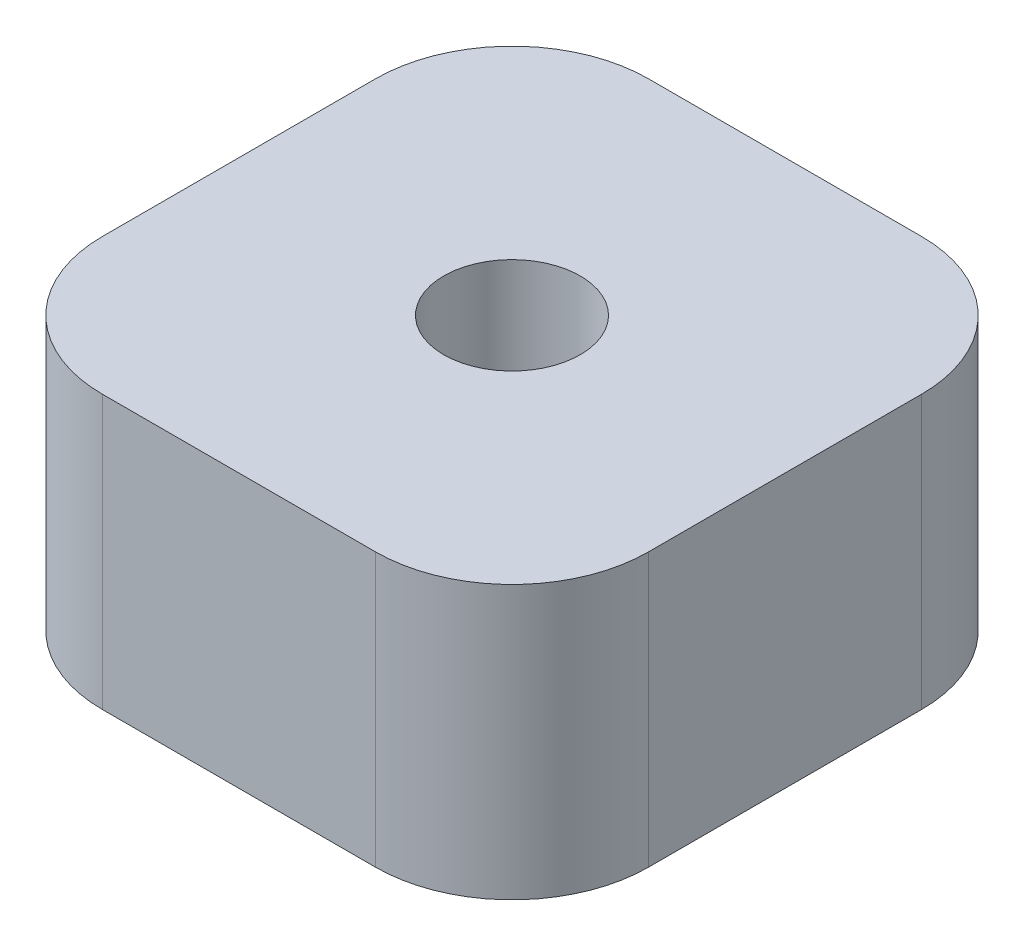
ISO-10303-21;
HEADER;
FILE_DESCRIPTION(('STEP AP214'),'2;1');
FILE_NAME('part.step','',(''),(''),'','','');
FILE_SCHEMA(('AUTOMOTIVE_DESIGN { 1 0 10303 214 1 1 1 1 }'));
ENDSEC;
DATA;
#1=APPLICATION_CONTEXT('core data for automotive mechanical design processes');
#2=APPLICATION_PROTOCOL_DEFINITION('international standard','automotive_design',2000,#1);
#3=PRODUCT_CONTEXT('',#1,'mechanical');
#4=PRODUCT('Part','Part','',(#3));
#5=PRODUCT_RELATED_PRODUCT_CATEGORY('part','',(#4));
#6=PRODUCT_DEFINITION_FORMATION('','',#4);
#7=PRODUCT_DEFINITION_CONTEXT('part definition',#1,'design');
#8=PRODUCT_DEFINITION('design','',#6,#7);
#9=PRODUCT_DEFINITION_SHAPE('','',#8);
#10=(LENGTH_UNIT() NAMED_UNIT(*) SI_UNIT(.MILLI.,.METRE.));
#11=(NAMED_UNIT(*) PLANE_ANGLE_UNIT() SI_UNIT($,.RADIAN.));
#12=(NAMED_UNIT(*) SI_UNIT($,.STERADIAN.) SOLID_ANGLE_UNIT());
#13=UNCERTAINTY_MEASURE_WITH_UNIT(LENGTH_MEASURE(1.E-05),#10,'distance_accuracy_value','');
#14=(GEOMETRIC_REPRESENTATION_CONTEXT(3) GLOBAL_UNCERTAINTY_ASSIGNED_CONTEXT((#13)) GLOBAL_UNIT_ASSIGNED_CONTEXT((#10,
#11,#12)) REPRESENTATION_CONTEXT('',''));
#15=CARTESIAN_POINT('',(0.,0.,0.));
#16=DIRECTION('',(0.,0.,1.));
#17=DIRECTION('',(1.,0.,0.));
#18=AXIS2_PLACEMENT_3D('',#15,#16,#17);
#19=CARTESIAN_POINT('',(0.,12.7,0.));
#20=DIRECTION('',(0.,-1.,0.));
#21=DIRECTION('',(0.,0.,-1.));
#22=AXIS2_PLACEMENT_3D('',#19,#20,#21);
#23=PLANE('',#22);
#24=DIRECTION('',(1.,0.,0.));
#25=VECTOR('',#24,1.);
#26=CARTESIAN_POINT('',(-12.7,12.7,12.7));
#27=LINE('',#26,#25);
#28=CARTESIAN_POINT('',(-6.35,12.7,12.7));
#29=VERTEX_POINT('',#28);
#30=CARTESIAN_POINT('',(6.35,12.7,12.7));
#31=VERTEX_POINT('',#30);
#32=EDGE_CURVE('E154',#29,#31,#27,.T.);
#33=ORIENTED_EDGE('',*,*,#32,.T.);
#34=CARTESIAN_POINT('',(6.35,12.7,6.35));
#35=DIRECTION('',(0.,-1.,0.));
#36=DIRECTION('',(0.,0.,-1.));
#37=AXIS2_PLACEMENT_3D('',#34,#35,#36);
#38=CIRCLE('',#37,6.35);
#39=CARTESIAN_POINT('',(12.7,12.7,6.35));
#40=VERTEX_POINT('',#39);
#41=EDGE_CURVE('E184',#31,#40,#38,.F.);
#42=ORIENTED_EDGE('',*,*,#41,.T.);
#43=DIRECTION('',(0.,0.,-1.));
#44=VECTOR('',#43,1.);
#45=CARTESIAN_POINT('',(12.7,12.7,12.7));
#46=LINE('',#45,#44);
#47=CARTESIAN_POINT('',(12.7,12.7,-6.35));
#48=VERTEX_POINT('',#47);
#49=EDGE_CURVE('E133',#40,#48,#46,.T.);
#50=ORIENTED_EDGE('',*,*,#49,.T.);
#51=CARTESIAN_POINT('',(6.35,12.7,-6.35));
#52=DIRECTION('',(0.,-1.,0.));
#53=DIRECTION('',(0.,0.,-1.));
#54=AXIS2_PLACEMENT_3D('',#51,#52,#53);
#55=CIRCLE('',#54,6.35);
#56=CARTESIAN_POINT('',(6.35,12.7,-12.7));
#57=VERTEX_POINT('',#56);
#58=EDGE_CURVE('E181',#48,#57,#55,.F.);
#59=ORIENTED_EDGE('',*,*,#58,.T.);
#60=DIRECTION('',(-1.,0.,0.));
#61=VECTOR('',#60,1.);
#62=CARTESIAN_POINT('',(-12.7,12.7,-12.7));
#63=LINE('',#62,#61);
#64=CARTESIAN_POINT('',(-6.35,12.7,-12.7));
#65=VERTEX_POINT('',#64);
#66=EDGE_CURVE('E199',#57,#65,#63,.T.);
#67=ORIENTED_EDGE('',*,*,#66,.T.);
#68=CARTESIAN_POINT('',(-6.35,12.7,-6.35));
#69=DIRECTION('',(0.,-1.,0.));
#70=DIRECTION('',(0.,0.,-1.));
#71=AXIS2_PLACEMENT_3D('',#68,#69,#70);
#72=CIRCLE('',#71,6.35);
#73=CARTESIAN_POINT('',(-12.7,12.7,-6.35));
#74=VERTEX_POINT('',#73);
#75=EDGE_CURVE('E67',#65,#74,#72,.F.);
#76=ORIENTED_EDGE('',*,*,#75,.T.);
#77=DIRECTION('',(0.,0.,1.));
#78=VECTOR('',#77,1.);
#79=CARTESIAN_POINT('',(-12.7,12.7,12.7));
#80=LINE('',#79,#78);
#81=CARTESIAN_POINT('',(-12.7,12.7,6.35));
#82=VERTEX_POINT('',#81);
#83=EDGE_CURVE('E197',#74,#82,#80,.T.);
#84=ORIENTED_EDGE('',*,*,#83,.T.);
#85=CARTESIAN_POINT('',(-6.35,12.7,6.35));
#86=DIRECTION('',(0.,-1.,0.));
#87=DIRECTION('',(0.,0.,-1.));
#88=AXIS2_PLACEMENT_3D('',#85,#86,#87);
#89=CIRCLE('',#88,6.35);
#90=EDGE_CURVE('E176',#82,#29,#89,.F.);
#91=ORIENTED_EDGE('',*,*,#90,.T.);
#92=EDGE_LOOP('',(#33,#42,#50,#59,#67,#76,#84,#91));
#93=FACE_BOUND('',#92,.T.);
#94=CARTESIAN_POINT('',(0.,12.7,0.));
#95=DIRECTION('',(0.,1.,0.));
#96=DIRECTION('',(0.,0.,1.));
#97=AXIS2_PLACEMENT_3D('',#94,#95,#96);
#98=CIRCLE('',#97,3.175);
#99=CARTESIAN_POINT('',(0.,12.7,3.175));
#100=VERTEX_POINT('',#99);
#101=EDGE_CURVE('E143',#100,#100,#98,.T.);
#102=ORIENTED_EDGE('',*,*,#101,.F.);
#103=EDGE_LOOP('',(#102));
#104=FACE_BOUND('',#103,.T.);
#105=ADVANCED_FACE('F45',(#93,#104),#23,.F.);
#106=CARTESIAN_POINT('',(0.,0.,0.));
#107=DIRECTION('',(0.,-1.,0.));
#108=DIRECTION('',(0.,0.,-1.));
#109=AXIS2_PLACEMENT_3D('',#106,#107,#108);
#110=PLANE('',#109);
#111=DIRECTION('',(0.,0.,-1.));
#112=VECTOR('',#111,1.);
#113=CARTESIAN_POINT('',(12.7,0.,12.7));
#114=LINE('',#113,#112);
#115=CARTESIAN_POINT('',(12.7,0.,6.35));
#116=VERTEX_POINT('',#115);
#117=CARTESIAN_POINT('',(12.7,0.,-6.35));
#118=VERTEX_POINT('',#117);
#119=EDGE_CURVE('E130',#116,#118,#114,.T.);
#120=ORIENTED_EDGE('',*,*,#119,.F.);
#121=CARTESIAN_POINT('',(6.35,0.,6.35));
#122=DIRECTION('',(0.,-1.,0.));
#123=DIRECTION('',(0.,0.,-1.));
#124=AXIS2_PLACEMENT_3D('',#121,#122,#123);
#125=CIRCLE('',#124,6.35);
#126=CARTESIAN_POINT('',(6.35,0.,12.7));
#127=VERTEX_POINT('',#126);
#128=EDGE_CURVE('E112',#116,#127,#125,.T.);
#129=ORIENTED_EDGE('',*,*,#128,.T.);
#130=DIRECTION('',(1.,0.,0.));
#131=VECTOR('',#130,1.);
#132=CARTESIAN_POINT('',(-12.7,0.,12.7));
#133=LINE('',#132,#131);
#134=CARTESIAN_POINT('',(-6.35,0.,12.7));
#135=VERTEX_POINT('',#134);
#136=EDGE_CURVE('E159',#135,#127,#133,.T.);
#137=ORIENTED_EDGE('',*,*,#136,.F.);
#138=CARTESIAN_POINT('',(-6.35,0.,6.35));
#139=DIRECTION('',(0.,-1.,0.));
#140=DIRECTION('',(0.,0.,-1.));
#141=AXIS2_PLACEMENT_3D('',#138,#139,#140);
#142=CIRCLE('',#141,6.35);
#143=CARTESIAN_POINT('',(-12.7,0.,6.35));
#144=VERTEX_POINT('',#143);
#145=EDGE_CURVE('E135',#135,#144,#142,.T.);
#146=ORIENTED_EDGE('',*,*,#145,.T.);
#147=DIRECTION('',(0.,0.,1.));
#148=VECTOR('',#147,1.);
#149=CARTESIAN_POINT('',(-12.7,0.,12.7));
#150=LINE('',#149,#148);
#151=CARTESIAN_POINT('',(-12.7,0.,-6.35));
#152=VERTEX_POINT('',#151);
#153=EDGE_CURVE('E148',#152,#144,#150,.T.);
#154=ORIENTED_EDGE('',*,*,#153,.F.);
#155=CARTESIAN_POINT('',(-6.35,0.,-6.35));
#156=DIRECTION('',(0.,-1.,0.));
#157=DIRECTION('',(0.,0.,-1.));
#158=AXIS2_PLACEMENT_3D('',#155,#156,#157);
#159=CIRCLE('',#158,6.35);
#160=CARTESIAN_POINT('',(-6.35,0.,-12.7));
#161=VERTEX_POINT('',#160);
#162=EDGE_CURVE('E166',#152,#161,#159,.T.);
#163=ORIENTED_EDGE('',*,*,#162,.T.);
#164=DIRECTION('',(-1.,0.,0.));
#165=VECTOR('',#164,1.);
#166=CARTESIAN_POINT('',(-12.7,0.,-12.7));
#167=LINE('',#166,#165);
#168=CARTESIAN_POINT('',(6.35,0.,-12.7));
#169=VERTEX_POINT('',#168);
#170=EDGE_CURVE('E142',#169,#161,#167,.T.);
#171=ORIENTED_EDGE('',*,*,#170,.F.);
#172=CARTESIAN_POINT('',(6.35,0.,-6.35));
#173=DIRECTION('',(0.,-1.,0.));
#174=DIRECTION('',(0.,0.,-1.));
#175=AXIS2_PLACEMENT_3D('',#172,#173,#174);
#176=CIRCLE('',#175,6.35);
#177=EDGE_CURVE('E124',#169,#118,#176,.T.);
#178=ORIENTED_EDGE('',*,*,#177,.T.);
#179=EDGE_LOOP('',(#120,#129,#137,#146,#154,#163,#171,#178));
#180=FACE_BOUND('',#179,.T.);
#181=CARTESIAN_POINT('',(0.,0.,0.));
#182=DIRECTION('',(0.,1.,0.));
#183=DIRECTION('',(0.,0.,1.));
#184=AXIS2_PLACEMENT_3D('',#181,#182,#183);
#185=CIRCLE('',#184,3.175);
#186=CARTESIAN_POINT('',(0.,0.,3.175));
#187=VERTEX_POINT('',#186);
#188=EDGE_CURVE('E151',#187,#187,#185,.T.);
#189=ORIENTED_EDGE('',*,*,#188,.T.);
#190=EDGE_LOOP('',(#189));
#191=FACE_BOUND('',#190,.T.);
#192=ADVANCED_FACE('F138',(#180,#191),#110,.T.);
#193=CARTESIAN_POINT('',(12.7,12.7,12.7));
#194=DIRECTION('',(-1.,0.,0.));
#195=DIRECTION('',(0.,0.,1.));
#196=AXIS2_PLACEMENT_3D('',#193,#194,#195);
#197=PLANE('',#196);
#198=ORIENTED_EDGE('',*,*,#49,.F.);
#199=DIRECTION('',(0.,-1.,0.));
#200=VECTOR('',#199,1.);
#201=CARTESIAN_POINT('',(12.7,12.7,6.35));
#202=LINE('',#201,#200);
#203=EDGE_CURVE('E116',#40,#116,#202,.T.);
#204=ORIENTED_EDGE('',*,*,#203,.T.);
#205=ORIENTED_EDGE('',*,*,#119,.T.);
#206=DIRECTION('',(0.,-1.,0.));
#207=VECTOR('',#206,1.);
#208=CARTESIAN_POINT('',(12.7,12.7,-6.35));
#209=LINE('',#208,#207);
#210=EDGE_CURVE('E136',#118,#48,#209,.F.);
#211=ORIENTED_EDGE('',*,*,#210,.T.);
#212=EDGE_LOOP('',(#198,#204,#205,#211));
#213=FACE_BOUND('',#212,.T.);
#214=ADVANCED_FACE('F129',(#213),#197,.F.);
#215=CARTESIAN_POINT('',(-12.7,12.7,-12.7));
#216=DIRECTION('',(0.,0.,1.));
#217=DIRECTION('',(1.,0.,0.));
#218=AXIS2_PLACEMENT_3D('',#215,#216,#217);
#219=PLANE('',#218);
#220=ORIENTED_EDGE('',*,*,#66,.F.);
#221=DIRECTION('',(0.,-1.,0.));
#222=VECTOR('',#221,1.);
#223=CARTESIAN_POINT('',(6.35,12.7,-12.7));
#224=LINE('',#223,#222);
#225=EDGE_CURVE('E190',#57,#169,#224,.T.);
#226=ORIENTED_EDGE('',*,*,#225,.T.);
#227=ORIENTED_EDGE('',*,*,#170,.T.);
#228=DIRECTION('',(0.,-1.,0.));
#229=VECTOR('',#228,1.);
#230=CARTESIAN_POINT('',(-6.35,12.7,-12.7));
#231=LINE('',#230,#229);
#232=EDGE_CURVE('E187',#161,#65,#231,.F.);
#233=ORIENTED_EDGE('',*,*,#232,.T.);
#234=EDGE_LOOP('',(#220,#226,#227,#233));
#235=FACE_BOUND('',#234,.T.);
#236=ADVANCED_FACE('F233',(#235),#219,.F.);
#237=CARTESIAN_POINT('',(-12.7,12.7,12.7));
#238=DIRECTION('',(1.,0.,0.));
#239=DIRECTION('',(0.,0.,-1.));
#240=AXIS2_PLACEMENT_3D('',#237,#238,#239);
#241=PLANE('',#240);
#242=ORIENTED_EDGE('',*,*,#83,.F.);
#243=DIRECTION('',(0.,-1.,0.));
#244=VECTOR('',#243,1.);
#245=CARTESIAN_POINT('',(-12.7,12.7,-6.35));
#246=LINE('',#245,#244);
#247=EDGE_CURVE('E11',#74,#152,#246,.T.);
#248=ORIENTED_EDGE('',*,*,#247,.T.);
#249=ORIENTED_EDGE('',*,*,#153,.T.);
#250=DIRECTION('',(0.,-1.,0.));
#251=VECTOR('',#250,1.);
#252=CARTESIAN_POINT('',(-12.7,12.7,6.35));
#253=LINE('',#252,#251);
#254=EDGE_CURVE('E54',#144,#82,#253,.F.);
#255=ORIENTED_EDGE('',*,*,#254,.T.);
#256=EDGE_LOOP('',(#242,#248,#249,#255));
#257=FACE_BOUND('',#256,.T.);
#258=ADVANCED_FACE('F221',(#257),#241,.F.);
#259=CARTESIAN_POINT('',(-12.7,12.7,12.7));
#260=DIRECTION('',(0.,0.,-1.));
#261=DIRECTION('',(-1.,0.,0.));
#262=AXIS2_PLACEMENT_3D('',#259,#260,#261);
#263=PLANE('',#262);
#264=ORIENTED_EDGE('',*,*,#136,.T.);
#265=DIRECTION('',(0.,-1.,0.));
#266=VECTOR('',#265,1.);
#267=CARTESIAN_POINT('',(6.35,12.7,12.7));
#268=LINE('',#267,#266);
#269=EDGE_CURVE('E117',#127,#31,#268,.F.);
#270=ORIENTED_EDGE('',*,*,#269,.T.);
#271=ORIENTED_EDGE('',*,*,#32,.F.);
#272=DIRECTION('',(0.,-1.,0.));
#273=VECTOR('',#272,1.);
#274=CARTESIAN_POINT('',(-6.35,12.7,12.7));
#275=LINE('',#274,#273);
#276=EDGE_CURVE('E123',#29,#135,#275,.T.);
#277=ORIENTED_EDGE('',*,*,#276,.T.);
#278=EDGE_LOOP('',(#264,#270,#271,#277));
#279=FACE_BOUND('',#278,.T.);
#280=ADVANCED_FACE('F211',(#279),#263,.F.);
#281=CARTESIAN_POINT('',(0.,12.7,0.));
#282=DIRECTION('',(0.,-1.,0.));
#283=DIRECTION('',(0.,0.,-1.));
#284=AXIS2_PLACEMENT_3D('',#281,#282,#283);
#285=CYLINDRICAL_SURFACE('',#284,3.175);
#286=ORIENTED_EDGE('',*,*,#101,.T.);
#287=EDGE_LOOP('',(#286));
#288=FACE_BOUND('',#287,.T.);
#289=ORIENTED_EDGE('',*,*,#188,.F.);
#290=EDGE_LOOP('',(#289));
#291=FACE_BOUND('',#290,.T.);
#292=ADVANCED_FACE('F209',(#288,#291),#285,.F.);
#293=CARTESIAN_POINT('',(6.35,12.7,6.35));
#294=DIRECTION('',(0.,-1.,0.));
#295=DIRECTION('',(0.,0.,-1.));
#296=AXIS2_PLACEMENT_3D('',#293,#294,#295);
#297=CYLINDRICAL_SURFACE('',#296,6.35);
#298=ORIENTED_EDGE('',*,*,#41,.F.);
#299=ORIENTED_EDGE('',*,*,#269,.F.);
#300=ORIENTED_EDGE('',*,*,#128,.F.);
#301=ORIENTED_EDGE('',*,*,#203,.F.);
#302=EDGE_LOOP('',(#298,#299,#300,#301));
#303=FACE_BOUND('',#302,.T.);
#304=ADVANCED_FACE('F115',(#303),#297,.T.);
#305=CARTESIAN_POINT('',(6.35,12.7,-6.35));
#306=DIRECTION('',(0.,-1.,0.));
#307=DIRECTION('',(0.,0.,-1.));
#308=AXIS2_PLACEMENT_3D('',#305,#306,#307);
#309=CYLINDRICAL_SURFACE('',#308,6.35);
#310=ORIENTED_EDGE('',*,*,#58,.F.);
#311=ORIENTED_EDGE('',*,*,#210,.F.);
#312=ORIENTED_EDGE('',*,*,#177,.F.);
#313=ORIENTED_EDGE('',*,*,#225,.F.);
#314=EDGE_LOOP('',(#310,#311,#312,#313));
#315=FACE_BOUND('',#314,.T.);
#316=ADVANCED_FACE('F218',(#315),#309,.T.);
#317=CARTESIAN_POINT('',(-6.35,12.7,-6.35));
#318=DIRECTION('',(0.,-1.,0.));
#319=DIRECTION('',(0.,0.,-1.));
#320=AXIS2_PLACEMENT_3D('',#317,#318,#319);
#321=CYLINDRICAL_SURFACE('',#320,6.35);
#322=ORIENTED_EDGE('',*,*,#75,.F.);
#323=ORIENTED_EDGE('',*,*,#232,.F.);
#324=ORIENTED_EDGE('',*,*,#162,.F.);
#325=ORIENTED_EDGE('',*,*,#247,.F.);
#326=EDGE_LOOP('',(#322,#323,#324,#325));
#327=FACE_BOUND('',#326,.T.);
#328=ADVANCED_FACE('F240',(#327),#321,.T.);
#329=CARTESIAN_POINT('',(-6.35,12.7,6.35));
#330=DIRECTION('',(0.,-1.,0.));
#331=DIRECTION('',(0.,0.,-1.));
#332=AXIS2_PLACEMENT_3D('',#329,#330,#331);
#333=CYLINDRICAL_SURFACE('',#332,6.35);
#334=ORIENTED_EDGE('',*,*,#90,.F.);
#335=ORIENTED_EDGE('',*,*,#254,.F.);
#336=ORIENTED_EDGE('',*,*,#145,.F.);
#337=ORIENTED_EDGE('',*,*,#276,.F.);
#338=EDGE_LOOP('',(#334,#335,#336,#337));
#339=FACE_BOUND('',#338,.T.);
#340=ADVANCED_FACE('F47',(#339),#333,.T.);
#341=CLOSED_SHELL('',(#105,#192,#214,#236,#258,#280,#292,#304,#316,#328,#340));
#342=MANIFOLD_SOLID_BREP('B2',#341);
#343=ADVANCED_BREP_SHAPE_REPRESENTATION('',(#18,#342),#14);
#344=SHAPE_DEFINITION_REPRESENTATION(#9,#343);
ENDSEC;
END-ISO-10303-21;
